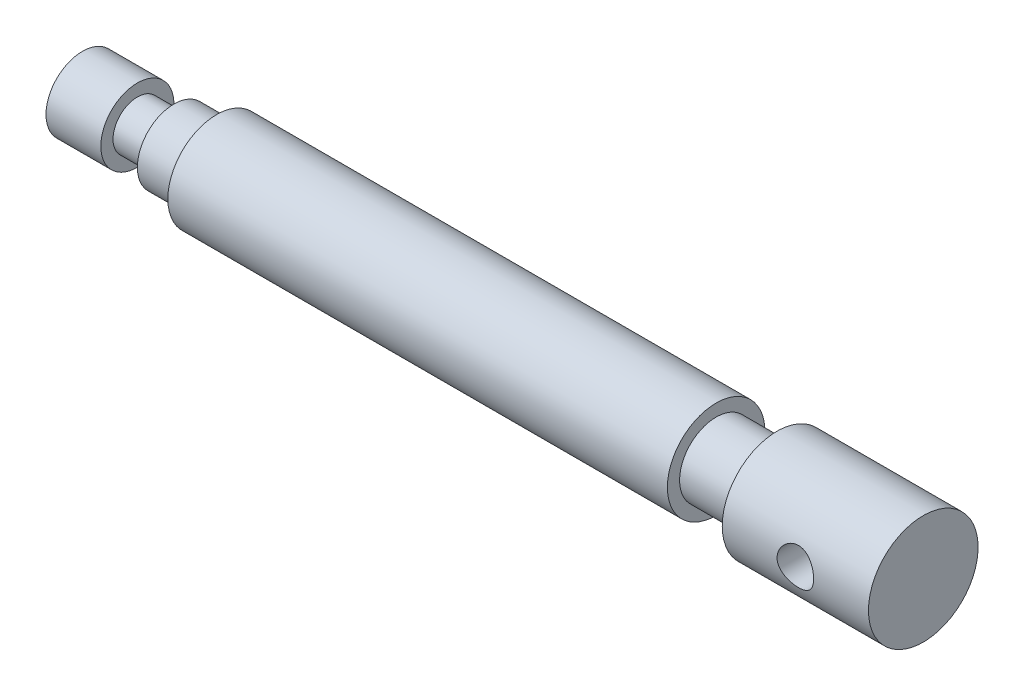
ISO-10303-21;
HEADER;
FILE_DESCRIPTION(('STEP AP214'),'2;1');
FILE_NAME('part.step','',(''),(''),'','','');
FILE_SCHEMA(('AUTOMOTIVE_DESIGN { 1 0 10303 214 1 1 1 1 }'));
ENDSEC;
DATA;
#1=APPLICATION_CONTEXT('core data for automotive mechanical design processes');
#2=APPLICATION_PROTOCOL_DEFINITION('international standard','automotive_design',2000,#1);
#3=PRODUCT_CONTEXT('',#1,'mechanical');
#4=PRODUCT('Part','Part','',(#3));
#5=PRODUCT_RELATED_PRODUCT_CATEGORY('part','',(#4));
#6=PRODUCT_DEFINITION_FORMATION('','',#4);
#7=PRODUCT_DEFINITION_CONTEXT('part definition',#1,'design');
#8=PRODUCT_DEFINITION('design','',#6,#7);
#9=PRODUCT_DEFINITION_SHAPE('','',#8);
#10=(LENGTH_UNIT() NAMED_UNIT(*) SI_UNIT(.MILLI.,.METRE.));
#11=(NAMED_UNIT(*) PLANE_ANGLE_UNIT() SI_UNIT($,.RADIAN.));
#12=(NAMED_UNIT(*) SI_UNIT($,.STERADIAN.) SOLID_ANGLE_UNIT());
#13=UNCERTAINTY_MEASURE_WITH_UNIT(LENGTH_MEASURE(1.E-05),#10,'distance_accuracy_value','');
#14=(GEOMETRIC_REPRESENTATION_CONTEXT(3) GLOBAL_UNCERTAINTY_ASSIGNED_CONTEXT((#13)) GLOBAL_UNIT_ASSIGNED_CONTEXT((#10,
#11,#12)) REPRESENTATION_CONTEXT('',''));
#15=CARTESIAN_POINT('',(0.,0.,0.));
#16=DIRECTION('',(0.,0.,1.));
#17=DIRECTION('',(1.,0.,0.));
#18=AXIS2_PLACEMENT_3D('',#15,#16,#17);
#19=CARTESIAN_POINT('',(35.,6.,0.));
#20=DIRECTION('',(-1.,0.,0.));
#21=DIRECTION('',(0.,0.,1.));
#22=AXIS2_PLACEMENT_3D('',#19,#20,#21);
#23=PLANE('',#22);
#24=CARTESIAN_POINT('',(35.,0.,0.));
#25=DIRECTION('',(-1.,0.,0.));
#26=DIRECTION('',(0.,0.,1.));
#27=AXIS2_PLACEMENT_3D('',#24,#25,#26);
#28=CIRCLE('',#27,8.);
#29=CARTESIAN_POINT('',(35.,0.,8.));
#30=VERTEX_POINT('',#29);
#31=EDGE_CURVE('E60',#30,#30,#28,.T.);
#32=ORIENTED_EDGE('',*,*,#31,.F.);
#33=EDGE_LOOP('',(#32));
#34=FACE_BOUND('',#33,.T.);
#35=CARTESIAN_POINT('',(35.,0.,0.));
#36=DIRECTION('',(-1.,0.,0.));
#37=DIRECTION('',(0.,0.,1.));
#38=AXIS2_PLACEMENT_3D('',#35,#36,#37);
#39=CIRCLE('',#38,6.);
#40=CARTESIAN_POINT('',(35.,0.,6.));
#41=VERTEX_POINT('',#40);
#42=EDGE_CURVE('E105',#41,#41,#39,.T.);
#43=ORIENTED_EDGE('',*,*,#42,.T.);
#44=EDGE_LOOP('',(#43));
#45=FACE_BOUND('',#44,.T.);
#46=ADVANCED_FACE('F43',(#34,#45),#23,.F.);
#47=CARTESIAN_POINT('',(-69.,0.,0.));
#48=DIRECTION('',(-1.,0.,0.));
#49=DIRECTION('',(0.,0.,1.));
#50=AXIS2_PLACEMENT_3D('',#47,#48,#49);
#51=CYLINDRICAL_SURFACE('',#50,7.99999999999999);
#52=CARTESIAN_POINT('',(-47.,0.,0.));
#53=DIRECTION('',(-1.,0.,0.));
#54=DIRECTION('',(0.,0.,1.));
#55=AXIS2_PLACEMENT_3D('',#52,#53,#54);
#56=CIRCLE('',#55,7.99999999999999);
#57=CARTESIAN_POINT('',(-47.,0.,7.99999999999999));
#58=VERTEX_POINT('',#57);
#59=EDGE_CURVE('E65',#58,#58,#56,.T.);
#60=ORIENTED_EDGE('',*,*,#59,.F.);
#61=EDGE_LOOP('',(#60));
#62=FACE_BOUND('',#61,.T.);
#63=ORIENTED_EDGE('',*,*,#31,.T.);
#64=EDGE_LOOP('',(#63));
#65=FACE_BOUND('',#64,.T.);
#66=ADVANCED_FACE('F94',(#62,#65),#51,.T.);
#67=CARTESIAN_POINT('',(-47.,6.,0.));
#68=DIRECTION('',(1.,0.,0.));
#69=DIRECTION('',(0.,0.,-1.));
#70=AXIS2_PLACEMENT_3D('',#67,#68,#69);
#71=PLANE('',#70);
#72=CARTESIAN_POINT('',(-47.,0.,0.));
#73=DIRECTION('',(-1.,0.,0.));
#74=DIRECTION('',(0.,0.,1.));
#75=AXIS2_PLACEMENT_3D('',#72,#73,#74);
#76=CIRCLE('',#75,6.);
#77=CARTESIAN_POINT('',(-47.,0.,6.));
#78=VERTEX_POINT('',#77);
#79=EDGE_CURVE('E141',#78,#78,#76,.T.);
#80=ORIENTED_EDGE('',*,*,#79,.F.);
#81=EDGE_LOOP('',(#80));
#82=FACE_BOUND('',#81,.T.);
#83=ORIENTED_EDGE('',*,*,#59,.T.);
#84=EDGE_LOOP('',(#83));
#85=FACE_BOUND('',#84,.T.);
#86=ADVANCED_FACE('F99',(#82,#85),#71,.F.);
#87=CARTESIAN_POINT('',(-69.,0.,0.));
#88=DIRECTION('',(-1.,0.,0.));
#89=DIRECTION('',(0.,0.,1.));
#90=AXIS2_PLACEMENT_3D('',#87,#88,#89);
#91=CYLINDRICAL_SURFACE('',#90,6.);
#92=CARTESIAN_POINT('',(-54.,0.,0.));
#93=DIRECTION('',(-1.,0.,0.));
#94=DIRECTION('',(0.,0.,1.));
#95=AXIS2_PLACEMENT_3D('',#92,#93,#94);
#96=CIRCLE('',#95,6.);
#97=CARTESIAN_POINT('',(-54.,0.,6.));
#98=VERTEX_POINT('',#97);
#99=EDGE_CURVE('E137',#98,#98,#96,.T.);
#100=ORIENTED_EDGE('',*,*,#99,.F.);
#101=EDGE_LOOP('',(#100));
#102=FACE_BOUND('',#101,.T.);
#103=ORIENTED_EDGE('',*,*,#79,.T.);
#104=EDGE_LOOP('',(#103));
#105=FACE_BOUND('',#104,.T.);
#106=ADVANCED_FACE('F150',(#102,#105),#91,.T.);
#107=CARTESIAN_POINT('',(-54.,4.,0.));
#108=DIRECTION('',(1.,0.,0.));
#109=DIRECTION('',(0.,0.,-1.));
#110=AXIS2_PLACEMENT_3D('',#107,#108,#109);
#111=PLANE('',#110);
#112=CARTESIAN_POINT('',(-54.,0.,0.));
#113=DIRECTION('',(-1.,0.,0.));
#114=DIRECTION('',(0.,0.,1.));
#115=AXIS2_PLACEMENT_3D('',#112,#113,#114);
#116=CIRCLE('',#115,4.);
#117=CARTESIAN_POINT('',(-54.,0.,4.));
#118=VERTEX_POINT('',#117);
#119=EDGE_CURVE('E133',#118,#118,#116,.T.);
#120=ORIENTED_EDGE('',*,*,#119,.F.);
#121=EDGE_LOOP('',(#120));
#122=FACE_BOUND('',#121,.T.);
#123=ORIENTED_EDGE('',*,*,#99,.T.);
#124=EDGE_LOOP('',(#123));
#125=FACE_BOUND('',#124,.T.);
#126=ADVANCED_FACE('F156',(#122,#125),#111,.F.);
#127=CARTESIAN_POINT('',(-69.,0.,0.));
#128=DIRECTION('',(-1.,0.,0.));
#129=DIRECTION('',(0.,0.,1.));
#130=AXIS2_PLACEMENT_3D('',#127,#128,#129);
#131=CYLINDRICAL_SURFACE('',#130,4.);
#132=CARTESIAN_POINT('',(-60.,0.,0.));
#133=DIRECTION('',(-1.,0.,0.));
#134=DIRECTION('',(0.,0.,1.));
#135=AXIS2_PLACEMENT_3D('',#132,#133,#134);
#136=CIRCLE('',#135,4.);
#137=CARTESIAN_POINT('',(-60.,0.,4.));
#138=VERTEX_POINT('',#137);
#139=EDGE_CURVE('E129',#138,#138,#136,.T.);
#140=ORIENTED_EDGE('',*,*,#139,.F.);
#141=EDGE_LOOP('',(#140));
#142=FACE_BOUND('',#141,.T.);
#143=ORIENTED_EDGE('',*,*,#119,.T.);
#144=EDGE_LOOP('',(#143));
#145=FACE_BOUND('',#144,.T.);
#146=ADVANCED_FACE('F163',(#142,#145),#131,.T.);
#147=CARTESIAN_POINT('',(-60.,6.,0.));
#148=DIRECTION('',(-1.,0.,0.));
#149=DIRECTION('',(0.,0.,1.));
#150=AXIS2_PLACEMENT_3D('',#147,#148,#149);
#151=PLANE('',#150);
#152=CARTESIAN_POINT('',(-60.,0.,0.));
#153=DIRECTION('',(-1.,0.,0.));
#154=DIRECTION('',(0.,0.,1.));
#155=AXIS2_PLACEMENT_3D('',#152,#153,#154);
#156=CIRCLE('',#155,6.);
#157=CARTESIAN_POINT('',(-60.,0.,6.));
#158=VERTEX_POINT('',#157);
#159=EDGE_CURVE('E125',#158,#158,#156,.T.);
#160=ORIENTED_EDGE('',*,*,#159,.F.);
#161=EDGE_LOOP('',(#160));
#162=FACE_BOUND('',#161,.T.);
#163=ORIENTED_EDGE('',*,*,#139,.T.);
#164=EDGE_LOOP('',(#163));
#165=FACE_BOUND('',#164,.T.);
#166=ADVANCED_FACE('F167',(#162,#165),#151,.F.);
#167=CARTESIAN_POINT('',(-69.,0.,0.));
#168=DIRECTION('',(-1.,0.,0.));
#169=DIRECTION('',(0.,0.,1.));
#170=AXIS2_PLACEMENT_3D('',#167,#168,#169);
#171=CYLINDRICAL_SURFACE('',#170,6.);
#172=CARTESIAN_POINT('',(-69.,0.,0.));
#173=DIRECTION('',(-1.,0.,0.));
#174=DIRECTION('',(0.,0.,1.));
#175=AXIS2_PLACEMENT_3D('',#172,#173,#174);
#176=CIRCLE('',#175,6.);
#177=CARTESIAN_POINT('',(-69.,0.,6.));
#178=VERTEX_POINT('',#177);
#179=EDGE_CURVE('E121',#178,#178,#176,.T.);
#180=ORIENTED_EDGE('',*,*,#179,.F.);
#181=EDGE_LOOP('',(#180));
#182=FACE_BOUND('',#181,.T.);
#183=ORIENTED_EDGE('',*,*,#159,.T.);
#184=EDGE_LOOP('',(#183));
#185=FACE_BOUND('',#184,.T.);
#186=ADVANCED_FACE('F171',(#182,#185),#171,.T.);
#187=CARTESIAN_POINT('',(-69.,0.,0.));
#188=DIRECTION('',(1.,0.,0.));
#189=DIRECTION('',(0.,0.,-1.));
#190=AXIS2_PLACEMENT_3D('',#187,#188,#189);
#191=PLANE('',#190);
#192=ORIENTED_EDGE('',*,*,#179,.T.);
#193=EDGE_LOOP('',(#192));
#194=FACE_BOUND('',#193,.T.);
#195=ADVANCED_FACE('F175',(#194),#191,.F.);
#196=CARTESIAN_POINT('',(69.,0.,0.));
#197=DIRECTION('',(-1.,0.,0.));
#198=DIRECTION('',(0.,0.,1.));
#199=AXIS2_PLACEMENT_3D('',#196,#197,#198);
#200=PLANE('',#199);
#201=CARTESIAN_POINT('',(69.,0.,0.));
#202=DIRECTION('',(-1.,0.,0.));
#203=DIRECTION('',(0.,0.,1.));
#204=AXIS2_PLACEMENT_3D('',#201,#202,#203);
#205=CIRCLE('',#204,9.);
#206=CARTESIAN_POINT('',(69.,0.,9.));
#207=VERTEX_POINT('',#206);
#208=EDGE_CURVE('E117',#207,#207,#205,.T.);
#209=ORIENTED_EDGE('',*,*,#208,.F.);
#210=EDGE_LOOP('',(#209));
#211=FACE_BOUND('',#210,.T.);
#212=ADVANCED_FACE('F90',(#211),#200,.F.);
#213=CARTESIAN_POINT('',(-69.,0.,0.));
#214=DIRECTION('',(-1.,0.,0.));
#215=DIRECTION('',(0.,0.,1.));
#216=AXIS2_PLACEMENT_3D('',#213,#214,#215);
#217=CYLINDRICAL_SURFACE('',#216,9.);
#218=CARTESIAN_POINT('',(60.,0.,-9.));
#219=CARTESIAN_POINT('',(60.0000007611949,0.16369008866017,-9.00000045902832));
#220=CARTESIAN_POINT('',(59.9865592016184,0.32737558361565,-8.99549308522634));
#221=CARTESIAN_POINT('',(59.9333126735484,0.649925282618917,-8.97795630609842));
#222=CARTESIAN_POINT('',(59.8935049681532,0.808788984356453,-8.96492601606457));
#223=CARTESIAN_POINT('',(59.7890422698479,1.11699836850533,-8.93175923719327));
#224=CARTESIAN_POINT('',(59.7244288126222,1.2663594776581,-8.9116346319256));
#225=CARTESIAN_POINT('',(59.572376481485,1.55212481041597,-8.86633337152025));
#226=CARTESIAN_POINT('',(59.4849331049922,1.68852647087611,-8.84115572003334));
#227=CARTESIAN_POINT('',(59.2865225854238,1.9492250250668,-8.78742283329015));
#228=CARTESIAN_POINT('',(59.1749062972185,2.07301110089493,-8.75878669391354));
#229=CARTESIAN_POINT('',(58.9326985358803,2.30049807810625,-8.70180944349364));
#230=CARTESIAN_POINT('',(58.8021028952145,2.40419455646839,-8.67346839871647));
#231=CARTESIAN_POINT('',(58.5210446544106,2.59147482668358,-8.61939997431821));
#232=CARTESIAN_POINT('',(58.3701187808036,2.6743945746631,-8.59377117827064));
#233=CARTESIAN_POINT('',(58.0554717166244,2.81345662163317,-8.54925916255803));
#234=CARTESIAN_POINT('',(57.8917544485118,2.8696070921603,-8.53037388482237));
#235=CARTESIAN_POINT('',(57.5619803355099,2.95162038452749,-8.50233909808131));
#236=CARTESIAN_POINT('',(57.3961883745328,2.97844034481531,-8.49288287308833));
#237=CARTESIAN_POINT('',(57.0622087375324,3.00402337000343,-8.48386969888522));
#238=CARTESIAN_POINT('',(56.8940218178724,3.00279510481416,-8.4843096906819));
#239=CARTESIAN_POINT('',(56.5681901086679,2.97305971111026,-8.4947704502454));
#240=CARTESIAN_POINT('',(56.4104147912429,2.94580173950099,-8.50435247602598));
#241=CARTESIAN_POINT('',(56.1018197411795,2.86681848854825,-8.53129973173652));
#242=CARTESIAN_POINT('',(55.9510008436948,2.81509027977561,-8.54866589352322));
#243=CARTESIAN_POINT('',(55.6577617512256,2.68781717418064,-8.58953733393746));
#244=CARTESIAN_POINT('',(55.5155159235914,2.61190214612179,-8.61313697379351));
#245=CARTESIAN_POINT('',(55.2453872751608,2.43866731890942,-8.66377675727179));
#246=CARTESIAN_POINT('',(55.1175086191999,2.34134133709202,-8.6908178937139));
#247=CARTESIAN_POINT('',(54.8727252055177,2.12204799804671,-8.74701987503222));
#248=CARTESIAN_POINT('',(54.7567419164728,1.99905945022893,-8.77621768064528));
#249=CARTESIAN_POINT('',(54.5468062000098,1.73501870991019,-8.8322081516111));
#250=CARTESIAN_POINT('',(54.4528558855065,1.59396478698245,-8.85900058614202));
#251=CARTESIAN_POINT('',(54.2889110992948,1.29584283913881,-8.90751323813381));
#252=CARTESIAN_POINT('',(54.2191635259778,1.13862982924901,-8.92918050024117));
#253=CARTESIAN_POINT('',(54.1073904781329,0.813807250093527,-8.96461701433304));
#254=CARTESIAN_POINT('',(54.0653553737297,0.646201314464864,-8.97838900964637));
#255=CARTESIAN_POINT('',(54.0118330019329,0.313151488587914,-8.99602881214321));
#256=CARTESIAN_POINT('',(53.9991005724818,0.14792879959454,-9.00030005501184));
#257=CARTESIAN_POINT('',(54.0009980207954,-0.182325209880711,-8.99966708084482));
#258=CARTESIAN_POINT('',(54.0156232799396,-0.347356557958951,-8.99476441258087));
#259=CARTESIAN_POINT('',(54.0708357232079,-0.667559598912766,-8.97660074151313));
#260=CARTESIAN_POINT('',(54.1106586181485,-0.82287842050453,-8.96358596133577));
#261=CARTESIAN_POINT('',(54.2141803334002,-1.12456787573872,-8.9307554049021));
#262=CARTESIAN_POINT('',(54.2778821984034,-1.27093736552582,-8.91093876140025));
#263=CARTESIAN_POINT('',(54.4292112955224,-1.55486488917982,-8.86586793861869));
#264=CARTESIAN_POINT('',(54.5174237798495,-1.69208987765144,-8.84048444267358));
#265=CARTESIAN_POINT('',(54.7145824500405,-1.95019449040676,-8.78715761748787));
#266=CARTESIAN_POINT('',(54.8235349680953,-2.07106910338673,-8.75921350781482));
#267=CARTESIAN_POINT('',(55.0649362530198,-2.2987575234189,-8.70230543941334));
#268=CARTESIAN_POINT('',(55.1982276807806,-2.40468290773731,-8.67335283262283));
#269=CARTESIAN_POINT('',(55.4813147034327,-2.59277256697072,-8.61899919884126));
#270=CARTESIAN_POINT('',(55.6311104359022,-2.67493664379304,-8.59359820146007));
#271=CARTESIAN_POINT('',(55.9430190458697,-2.81279079124908,-8.5494717537415));
#272=CARTESIAN_POINT('',(56.1051062375063,-2.86853439649506,-8.53073282378936));
#273=CARTESIAN_POINT('',(56.4371359501324,-2.95168400027807,-8.50232496919348));
#274=CARTESIAN_POINT('',(56.6070748962131,-2.97910276486182,-8.49265195870918));
#275=CARTESIAN_POINT('',(56.9405912881228,-3.00382884743203,-8.48393576622531));
#276=CARTESIAN_POINT('',(57.1040470208605,-3.0026107719252,-8.48437200772245));
#277=CARTESIAN_POINT('',(57.4282952247662,-2.97372688034608,-8.49453809471602));
#278=CARTESIAN_POINT('',(57.5890878538653,-2.94606263837576,-8.50426738708084));
#279=CARTESIAN_POINT('',(57.9004069890074,-2.86611543938804,-8.53153572914675));
#280=CARTESIAN_POINT('',(58.0510704750135,-2.81431003804654,-8.54892294067432));
#281=CARTESIAN_POINT('',(58.3416822208148,-2.68793809727924,-8.58949196455405));
#282=CARTESIAN_POINT('',(58.481628093564,-2.61336650566142,-8.61267506290179));
#283=CARTESIAN_POINT('',(58.7534510097687,-2.43978207775029,-8.66348487678138));
#284=CARTESIAN_POINT('',(58.8847095056952,-2.33984472829374,-8.69126134926411));
#285=CARTESIAN_POINT('',(59.1290694401526,-2.11992864940694,-8.74750068849758));
#286=CARTESIAN_POINT('',(59.2421657270642,-1.99994425335444,-8.77596374737117));
#287=CARTESIAN_POINT('',(59.4514332368675,-1.73772467076207,-8.83170091576632));
#288=CARTESIAN_POINT('',(59.546773043253,-1.59480454049919,-8.8588854540377));
#289=CARTESIAN_POINT('',(59.711971286552,-1.29407207221988,-8.90777973517836));
#290=CARTESIAN_POINT('',(59.7818362377661,-1.13626355439705,-8.92949087723789));
#291=CARTESIAN_POINT('',(59.891164897466,-0.817480941602932,-8.96416545205625));
#292=CARTESIAN_POINT('',(59.9318473987901,-0.656963273029229,-8.97747637267568));
#293=CARTESIAN_POINT('',(59.9862608420314,-0.330961248030742,-8.99539221192665));
#294=CARTESIAN_POINT('',(59.9999992304896,-0.16547827670624,-8.99999953595714));
#295=CARTESIAN_POINT('',(60.,0.,-9.));
#296=B_SPLINE_CURVE_WITH_KNOTS('',3,(#218,#219,#220,#221,#222,#223,#224,#225,#226,#227,#228,
#229,#230,#231,#232,#233,#234,#235,#236,#237,#238,#239,#240,#241,#242,#243,#244,#245,#246,#247,
#248,#249,#250,#251,#252,#253,#254,#255,#256,#257,#258,#259,#260,#261,#262,#263,#264,#265,#266,
#267,#268,#269,#270,#271,#272,#273,#274,#275,#276,#277,#278,#279,#280,#281,#282,#283,#284,#285,
#286,#287,#288,#289,#290,#291,#292,#293,#294,#295),.UNSPECIFIED.,.T.,.F.,(4,2,2,2,2,2,2,2,2,2,2,
2,2,2,2,2,2,2,2,2,2,2,2,2,2,2,2,2,2,2,2,2,2,2,2,2,2,2,4),(0.,0.490461318078033,
0.980973555802562,1.47066801861082,1.9604591333973,2.46554052848268,2.97073299862591,
3.49045154470412,4.010011340785,4.51205777225521,5.01394901962457,5.49290479653841,
5.97191792566446,6.45864513465392,6.94551307674622,7.45779917434101,7.97013437899855,
8.48755216951072,9.00479006631625,9.49960749525509,9.9943413949253,10.4747447393464,
10.9552093585231,11.4483119953121,11.9415654246567,12.4572306864226,12.9729002470499,
13.4875204148031,14.0019085411752,14.4898699819278,14.9778023805413,15.4564676124125,
15.9352391452793,16.4349020007541,16.9347063337134,17.453989825053,17.9731404345737,
18.4690967512144,18.9649159811442),.UNSPECIFIED.);
#297=CARTESIAN_POINT('',(60.,0.,-9.));
#298=VERTEX_POINT('',#297);
#299=EDGE_CURVE('E10',#298,#298,#296,.T.);
#300=ORIENTED_EDGE('',*,*,#299,.T.);
#301=EDGE_LOOP('',(#300));
#302=FACE_BOUND('',#301,.T.);
#303=CARTESIAN_POINT('',(60.,0.,9.));
#304=CARTESIAN_POINT('',(60.0000007611949,-0.16369008866017,9.00000045902832));
#305=CARTESIAN_POINT('',(59.9865592016184,-0.32737558361565,8.99549308522634));
#306=CARTESIAN_POINT('',(59.9333126735484,-0.649925282618917,8.97795630609842));
#307=CARTESIAN_POINT('',(59.8935049681532,-0.808788984356453,8.96492601606457));
#308=CARTESIAN_POINT('',(59.7890422698479,-1.11699836850533,8.93175923719327));
#309=CARTESIAN_POINT('',(59.7244288126222,-1.2663594776581,8.9116346319256));
#310=CARTESIAN_POINT('',(59.572376481485,-1.55212481041597,8.86633337152025));
#311=CARTESIAN_POINT('',(59.4849331049922,-1.68852647087611,8.84115572003334));
#312=CARTESIAN_POINT('',(59.2865225854238,-1.9492250250668,8.78742283329015));
#313=CARTESIAN_POINT('',(59.1749062972185,-2.07301110089493,8.75878669391354));
#314=CARTESIAN_POINT('',(58.9326985358803,-2.30049807810625,8.70180944349364));
#315=CARTESIAN_POINT('',(58.8021028952145,-2.40419455646839,8.67346839871647));
#316=CARTESIAN_POINT('',(58.5210446544106,-2.59147482668358,8.61939997431821));
#317=CARTESIAN_POINT('',(58.3701187808036,-2.6743945746631,8.59377117827064));
#318=CARTESIAN_POINT('',(58.0554717166244,-2.81345662163317,8.54925916255803));
#319=CARTESIAN_POINT('',(57.8917544485118,-2.8696070921603,8.53037388482237));
#320=CARTESIAN_POINT('',(57.5619803355099,-2.95162038452749,8.50233909808131));
#321=CARTESIAN_POINT('',(57.3961883745328,-2.97844034481531,8.49288287308833));
#322=CARTESIAN_POINT('',(57.0622087375324,-3.00402337000343,8.48386969888522));
#323=CARTESIAN_POINT('',(56.8940218178724,-3.00279510481416,8.4843096906819));
#324=CARTESIAN_POINT('',(56.5681901086679,-2.97305971111026,8.4947704502454));
#325=CARTESIAN_POINT('',(56.4104147912429,-2.94580173950099,8.50435247602598));
#326=CARTESIAN_POINT('',(56.1018197411795,-2.86681848854825,8.53129973173652));
#327=CARTESIAN_POINT('',(55.9510008436948,-2.81509027977561,8.54866589352322));
#328=CARTESIAN_POINT('',(55.6577617512256,-2.68781717418064,8.58953733393746));
#329=CARTESIAN_POINT('',(55.5155159235914,-2.61190214612179,8.61313697379351));
#330=CARTESIAN_POINT('',(55.2453872751608,-2.43866731890942,8.66377675727179));
#331=CARTESIAN_POINT('',(55.1175086191999,-2.34134133709202,8.6908178937139));
#332=CARTESIAN_POINT('',(54.8727252055177,-2.12204799804671,8.74701987503222));
#333=CARTESIAN_POINT('',(54.7567419164728,-1.99905945022893,8.77621768064528));
#334=CARTESIAN_POINT('',(54.5468062000098,-1.73501870991019,8.8322081516111));
#335=CARTESIAN_POINT('',(54.4528558855065,-1.59396478698245,8.85900058614202));
#336=CARTESIAN_POINT('',(54.2889110992948,-1.29584283913881,8.90751323813381));
#337=CARTESIAN_POINT('',(54.2191635259778,-1.13862982924901,8.92918050024117));
#338=CARTESIAN_POINT('',(54.1073904781329,-0.813807250093527,8.96461701433304));
#339=CARTESIAN_POINT('',(54.0653553737297,-0.646201314464864,8.97838900964637));
#340=CARTESIAN_POINT('',(54.0118330019329,-0.313151488587914,8.99602881214321));
#341=CARTESIAN_POINT('',(53.9991005724818,-0.14792879959454,9.00030005501184));
#342=CARTESIAN_POINT('',(54.0009980207954,0.182325209880711,8.99966708084482));
#343=CARTESIAN_POINT('',(54.0156232799396,0.347356557958951,8.99476441258087));
#344=CARTESIAN_POINT('',(54.0708357232079,0.667559598912766,8.97660074151313));
#345=CARTESIAN_POINT('',(54.1106586181485,0.82287842050453,8.96358596133577));
#346=CARTESIAN_POINT('',(54.2141803334002,1.12456787573872,8.9307554049021));
#347=CARTESIAN_POINT('',(54.2778821984034,1.27093736552582,8.91093876140025));
#348=CARTESIAN_POINT('',(54.4292112955224,1.55486488917982,8.86586793861869));
#349=CARTESIAN_POINT('',(54.5174237798495,1.69208987765144,8.84048444267358));
#350=CARTESIAN_POINT('',(54.7145824500405,1.95019449040676,8.78715761748787));
#351=CARTESIAN_POINT('',(54.8235349680953,2.07106910338673,8.75921350781482));
#352=CARTESIAN_POINT('',(55.0649362530198,2.2987575234189,8.70230543941334));
#353=CARTESIAN_POINT('',(55.1982276807806,2.40468290773731,8.67335283262283));
#354=CARTESIAN_POINT('',(55.4813147034327,2.59277256697072,8.61899919884126));
#355=CARTESIAN_POINT('',(55.6311104359022,2.67493664379304,8.59359820146007));
#356=CARTESIAN_POINT('',(55.9430190458697,2.81279079124908,8.5494717537415));
#357=CARTESIAN_POINT('',(56.1051062375063,2.86853439649506,8.53073282378936));
#358=CARTESIAN_POINT('',(56.4371359501324,2.95168400027807,8.50232496919348));
#359=CARTESIAN_POINT('',(56.6070748962131,2.97910276486182,8.49265195870918));
#360=CARTESIAN_POINT('',(56.9405912881228,3.00382884743203,8.48393576622531));
#361=CARTESIAN_POINT('',(57.1040470208605,3.0026107719252,8.48437200772245));
#362=CARTESIAN_POINT('',(57.4282952247662,2.97372688034608,8.49453809471602));
#363=CARTESIAN_POINT('',(57.5890878538653,2.94606263837576,8.50426738708084));
#364=CARTESIAN_POINT('',(57.9004069890074,2.86611543938804,8.53153572914675));
#365=CARTESIAN_POINT('',(58.0510704750135,2.81431003804654,8.54892294067432));
#366=CARTESIAN_POINT('',(58.3416822208148,2.68793809727924,8.58949196455405));
#367=CARTESIAN_POINT('',(58.481628093564,2.61336650566142,8.61267506290179));
#368=CARTESIAN_POINT('',(58.7534510097687,2.43978207775029,8.66348487678138));
#369=CARTESIAN_POINT('',(58.8847095056952,2.33984472829374,8.69126134926411));
#370=CARTESIAN_POINT('',(59.1290694401526,2.11992864940694,8.74750068849758));
#371=CARTESIAN_POINT('',(59.2421657270642,1.99994425335444,8.77596374737117));
#372=CARTESIAN_POINT('',(59.4514332368675,1.73772467076207,8.83170091576632));
#373=CARTESIAN_POINT('',(59.546773043253,1.59480454049919,8.8588854540377));
#374=CARTESIAN_POINT('',(59.711971286552,1.29407207221988,8.90777973517836));
#375=CARTESIAN_POINT('',(59.7818362377661,1.13626355439705,8.92949087723789));
#376=CARTESIAN_POINT('',(59.891164897466,0.817480941602932,8.96416545205625));
#377=CARTESIAN_POINT('',(59.9318473987901,0.656963273029229,8.97747637267568));
#378=CARTESIAN_POINT('',(59.9862608420314,0.330961248030742,8.99539221192665));
#379=CARTESIAN_POINT('',(59.9999992304896,0.16547827670624,8.99999953595714));
#380=CARTESIAN_POINT('',(60.,0.,9.));
#381=B_SPLINE_CURVE_WITH_KNOTS('',3,(#303,#304,#305,#306,#307,#308,#309,#310,#311,#312,#313,
#314,#315,#316,#317,#318,#319,#320,#321,#322,#323,#324,#325,#326,#327,#328,#329,#330,#331,#332,
#333,#334,#335,#336,#337,#338,#339,#340,#341,#342,#343,#344,#345,#346,#347,#348,#349,#350,#351,
#352,#353,#354,#355,#356,#357,#358,#359,#360,#361,#362,#363,#364,#365,#366,#367,#368,#369,#370,
#371,#372,#373,#374,#375,#376,#377,#378,#379,#380),.UNSPECIFIED.,.T.,.F.,(4,2,2,2,2,2,2,2,2,2,2,
2,2,2,2,2,2,2,2,2,2,2,2,2,2,2,2,2,2,2,2,2,2,2,2,2,2,2,4),(0.,0.490461318078033,
0.980973555802562,1.47066801861082,1.9604591333973,2.46554052848268,2.97073299862591,
3.49045154470412,4.010011340785,4.51205777225521,5.01394901962457,5.49290479653841,
5.97191792566446,6.45864513465392,6.94551307674622,7.45779917434101,7.97013437899855,
8.48755216951072,9.00479006631625,9.49960749525509,9.9943413949253,10.4747447393464,
10.9552093585231,11.4483119953121,11.9415654246567,12.4572306864226,12.9729002470499,
13.4875204148031,14.0019085411752,14.4898699819278,14.9778023805413,15.4564676124125,
15.9352391452793,16.4349020007541,16.9347063337134,17.453989825053,17.9731404345737,
18.4690967512144,18.9649159811442),.UNSPECIFIED.);
#382=CARTESIAN_POINT('',(60.,0.,9.));
#383=VERTEX_POINT('',#382);
#384=EDGE_CURVE('E55',#383,#383,#381,.T.);
#385=ORIENTED_EDGE('',*,*,#384,.T.);
#386=EDGE_LOOP('',(#385));
#387=FACE_BOUND('',#386,.T.);
#388=CARTESIAN_POINT('',(45.,0.,0.));
#389=DIRECTION('',(-1.,0.,0.));
#390=DIRECTION('',(0.,0.,1.));
#391=AXIS2_PLACEMENT_3D('',#388,#389,#390);
#392=CIRCLE('',#391,9.);
#393=CARTESIAN_POINT('',(45.,0.,9.));
#394=VERTEX_POINT('',#393);
#395=EDGE_CURVE('E111',#394,#394,#392,.T.);
#396=ORIENTED_EDGE('',*,*,#395,.F.);
#397=EDGE_LOOP('',(#396));
#398=FACE_BOUND('',#397,.T.);
#399=ORIENTED_EDGE('',*,*,#208,.T.);
#400=EDGE_LOOP('',(#399));
#401=FACE_BOUND('',#400,.T.);
#402=ADVANCED_FACE('F71',(#302,#387,#398,#401),#217,.T.);
#403=CARTESIAN_POINT('',(45.,9.,0.));
#404=DIRECTION('',(1.,0.,0.));
#405=DIRECTION('',(0.,0.,-1.));
#406=AXIS2_PLACEMENT_3D('',#403,#404,#405);
#407=PLANE('',#406);
#408=CARTESIAN_POINT('',(45.,0.,0.));
#409=DIRECTION('',(-1.,0.,0.));
#410=DIRECTION('',(0.,0.,1.));
#411=AXIS2_PLACEMENT_3D('',#408,#409,#410);
#412=CIRCLE('',#411,6.);
#413=CARTESIAN_POINT('',(45.,0.,6.));
#414=VERTEX_POINT('',#413);
#415=EDGE_CURVE('E107',#414,#414,#412,.T.);
#416=ORIENTED_EDGE('',*,*,#415,.F.);
#417=EDGE_LOOP('',(#416));
#418=FACE_BOUND('',#417,.T.);
#419=ORIENTED_EDGE('',*,*,#395,.T.);
#420=EDGE_LOOP('',(#419));
#421=FACE_BOUND('',#420,.T.);
#422=ADVANCED_FACE('F83',(#418,#421),#407,.F.);
#423=CARTESIAN_POINT('',(-69.,0.,0.));
#424=DIRECTION('',(-1.,0.,0.));
#425=DIRECTION('',(0.,0.,1.));
#426=AXIS2_PLACEMENT_3D('',#423,#424,#425);
#427=CYLINDRICAL_SURFACE('',#426,6.);
#428=ORIENTED_EDGE('',*,*,#42,.F.);
#429=EDGE_LOOP('',(#428));
#430=FACE_BOUND('',#429,.T.);
#431=ORIENTED_EDGE('',*,*,#415,.T.);
#432=EDGE_LOOP('',(#431));
#433=FACE_BOUND('',#432,.T.);
#434=ADVANCED_FACE('F79',(#430,#433),#427,.T.);
#435=CARTESIAN_POINT('',(57.,0.,-9.));
#436=DIRECTION('',(0.,0.,1.));
#437=DIRECTION('',(1.,0.,0.));
#438=AXIS2_PLACEMENT_3D('',#435,#436,#437);
#439=CYLINDRICAL_SURFACE('',#438,3.);
#440=ORIENTED_EDGE('',*,*,#384,.F.);
#441=EDGE_LOOP('',(#440));
#442=FACE_BOUND('',#441,.T.);
#443=ORIENTED_EDGE('',*,*,#299,.F.);
#444=EDGE_LOOP('',(#443));
#445=FACE_BOUND('',#444,.T.);
#446=ADVANCED_FACE('F75',(#442,#445),#439,.F.);
#447=CLOSED_SHELL('',(#46,#66,#86,#106,#126,#146,#166,#186,#195,#212,#402,#422,#434,#446));
#448=MANIFOLD_SOLID_BREP('B2',#447);
#449=ADVANCED_BREP_SHAPE_REPRESENTATION('',(#18,#448),#14);
#450=SHAPE_DEFINITION_REPRESENTATION(#9,#449);
ENDSEC;
END-ISO-10303-21;
